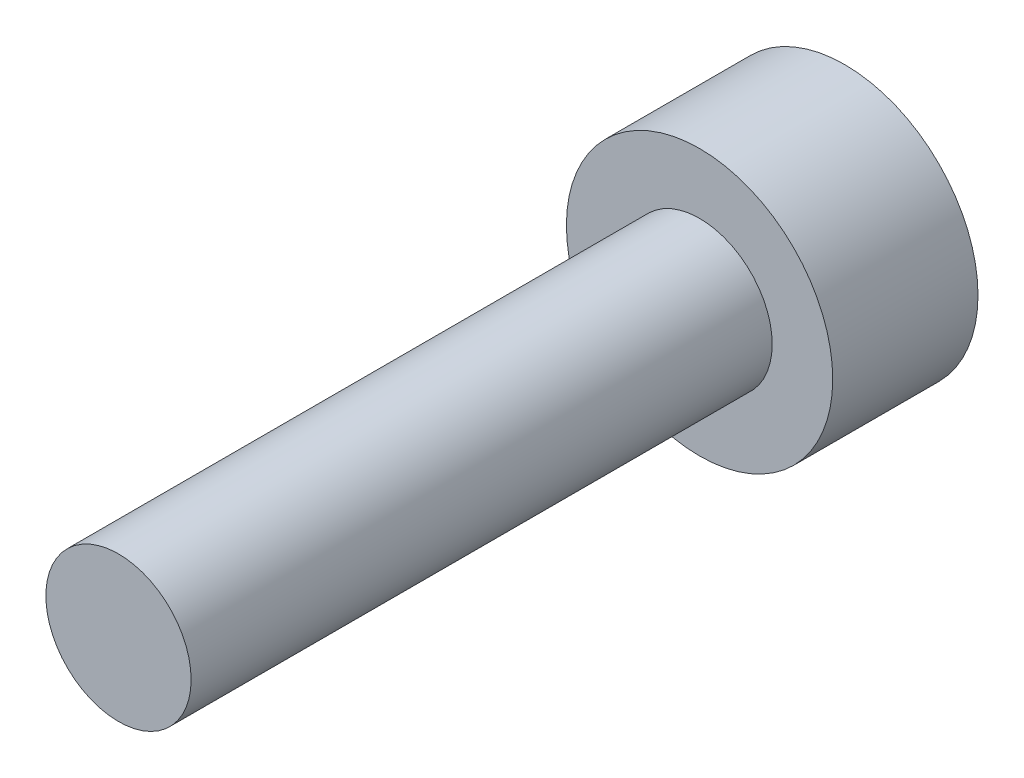
ISO-10303-21;
HEADER;
FILE_DESCRIPTION(('STEP AP214'),'2;1');
FILE_NAME('part.step','',(''),(''),'','','');
FILE_SCHEMA(('AUTOMOTIVE_DESIGN { 1 0 10303 214 1 1 1 1 }'));
ENDSEC;
DATA;
#1=APPLICATION_CONTEXT('core data for automotive mechanical design processes');
#2=APPLICATION_PROTOCOL_DEFINITION('international standard','automotive_design',2000,#1);
#3=PRODUCT_CONTEXT('',#1,'mechanical');
#4=PRODUCT('Part','Part','',(#3));
#5=PRODUCT_RELATED_PRODUCT_CATEGORY('part','',(#4));
#6=PRODUCT_DEFINITION_FORMATION('','',#4);
#7=PRODUCT_DEFINITION_CONTEXT('part definition',#1,'design');
#8=PRODUCT_DEFINITION('design','',#6,#7);
#9=PRODUCT_DEFINITION_SHAPE('','',#8);
#10=(LENGTH_UNIT() NAMED_UNIT(*) SI_UNIT(.MILLI.,.METRE.));
#11=(NAMED_UNIT(*) PLANE_ANGLE_UNIT() SI_UNIT($,.RADIAN.));
#12=(NAMED_UNIT(*) SI_UNIT($,.STERADIAN.) SOLID_ANGLE_UNIT());
#13=UNCERTAINTY_MEASURE_WITH_UNIT(LENGTH_MEASURE(1.E-05),#10,'distance_accuracy_value','');
#14=(GEOMETRIC_REPRESENTATION_CONTEXT(3) GLOBAL_UNCERTAINTY_ASSIGNED_CONTEXT((#13)) GLOBAL_UNIT_ASSIGNED_CONTEXT((#10,
#11,#12)) REPRESENTATION_CONTEXT('',''));
#15=CARTESIAN_POINT('',(0.,0.,0.));
#16=DIRECTION('',(0.,0.,1.));
#17=DIRECTION('',(1.,0.,0.));
#18=AXIS2_PLACEMENT_3D('',#15,#16,#17);
#19=CARTESIAN_POINT('',(0.,0.,-3.));
#20=DIRECTION('',(0.,0.,1.));
#21=DIRECTION('',(1.,0.,0.));
#22=AXIS2_PLACEMENT_3D('',#19,#20,#21);
#23=PLANE('',#22);
#24=CARTESIAN_POINT('',(0.,0.,-3.));
#25=DIRECTION('',(0.,0.,1.));
#26=DIRECTION('',(1.,0.,0.));
#27=AXIS2_PLACEMENT_3D('',#24,#25,#26);
#28=CIRCLE('',#27,2.75);
#29=CARTESIAN_POINT('',(2.75,0.,-3.));
#30=VERTEX_POINT('',#29);
#31=EDGE_CURVE('E50',#30,#30,#28,.T.);
#32=ORIENTED_EDGE('',*,*,#31,.F.);
#33=EDGE_LOOP('',(#32));
#34=FACE_BOUND('',#33,.T.);
#35=DIRECTION('',(0.866025403784441,-0.499999999999995,0.));
#36=VECTOR('',#35,1.);
#37=CARTESIAN_POINT('',(-1.24999999999999,-0.721687836487047,-3.));
#38=LINE('',#37,#36);
#39=CARTESIAN_POINT('',(-1.24999999999999,-0.721687836487047,-3.));
#40=VERTEX_POINT('',#39);
#41=CARTESIAN_POINT('',(0.,-1.44337567297406,-3.));
#42=VERTEX_POINT('',#41);
#43=EDGE_CURVE('E62',#40,#42,#38,.T.);
#44=ORIENTED_EDGE('',*,*,#43,.T.);
#45=DIRECTION('',(0.866025403784438,0.500000000000001,0.));
#46=VECTOR('',#45,1.);
#47=CARTESIAN_POINT('',(0.,-1.44337567297406,-3.));
#48=LINE('',#47,#46);
#49=CARTESIAN_POINT('',(1.25,-0.721687836487029,-3.));
#50=VERTEX_POINT('',#49);
#51=EDGE_CURVE('E139',#42,#50,#48,.T.);
#52=ORIENTED_EDGE('',*,*,#51,.T.);
#53=DIRECTION('',(0.,1.,0.));
#54=VECTOR('',#53,1.);
#55=CARTESIAN_POINT('',(1.25,-0.721687836487029,-3.));
#56=LINE('',#55,#54);
#57=CARTESIAN_POINT('',(1.25,0.721687836487038,-3.));
#58=VERTEX_POINT('',#57);
#59=EDGE_CURVE('E141',#50,#58,#56,.T.);
#60=ORIENTED_EDGE('',*,*,#59,.T.);
#61=DIRECTION('',(-0.866025403784442,0.499999999999995,0.));
#62=VECTOR('',#61,1.);
#63=CARTESIAN_POINT('',(1.25,0.721687836487038,-3.));
#64=LINE('',#63,#62);
#65=CARTESIAN_POINT('',(0.,1.44337567297406,-3.));
#66=VERTEX_POINT('',#65);
#67=EDGE_CURVE('E150',#58,#66,#64,.T.);
#68=ORIENTED_EDGE('',*,*,#67,.T.);
#69=DIRECTION('',(-0.866025403784434,-0.500000000000007,0.));
#70=VECTOR('',#69,1.);
#71=CARTESIAN_POINT('',(0.,1.44337567297406,-3.));
#72=LINE('',#71,#70);
#73=CARTESIAN_POINT('',(-1.25000000000001,0.721687836487021,-3.));
#74=VERTEX_POINT('',#73);
#75=EDGE_CURVE('E123',#66,#74,#72,.T.);
#76=ORIENTED_EDGE('',*,*,#75,.T.);
#77=DIRECTION('',(0.,-1.,0.));
#78=VECTOR('',#77,1.);
#79=CARTESIAN_POINT('',(-1.25000000000001,0.721687836487021,-3.));
#80=LINE('',#79,#78);
#81=EDGE_CURVE('E151',#74,#40,#80,.T.);
#82=ORIENTED_EDGE('',*,*,#81,.T.);
#83=EDGE_LOOP('',(#44,#52,#60,#68,#76,#82));
#84=FACE_BOUND('',#83,.T.);
#85=ADVANCED_FACE('F43',(#34,#84),#23,.F.);
#86=CARTESIAN_POINT('',(0.,0.,0.));
#87=DIRECTION('',(0.,0.,-1.));
#88=DIRECTION('',(-1.,0.,0.));
#89=AXIS2_PLACEMENT_3D('',#86,#87,#88);
#90=CYLINDRICAL_SURFACE('',#89,2.75);
#91=CARTESIAN_POINT('',(0.,0.,0.));
#92=DIRECTION('',(0.,0.,1.));
#93=DIRECTION('',(1.,0.,0.));
#94=AXIS2_PLACEMENT_3D('',#91,#92,#93);
#95=CIRCLE('',#94,2.75);
#96=CARTESIAN_POINT('',(2.75,0.,0.));
#97=VERTEX_POINT('',#96);
#98=EDGE_CURVE('E52',#97,#97,#95,.T.);
#99=ORIENTED_EDGE('',*,*,#98,.F.);
#100=EDGE_LOOP('',(#99));
#101=FACE_BOUND('',#100,.T.);
#102=ORIENTED_EDGE('',*,*,#31,.T.);
#103=EDGE_LOOP('',(#102));
#104=FACE_BOUND('',#103,.T.);
#105=ADVANCED_FACE('F44',(#101,#104),#90,.T.);
#106=CARTESIAN_POINT('',(0.,0.,0.));
#107=DIRECTION('',(0.,0.,1.));
#108=DIRECTION('',(1.,0.,0.));
#109=AXIS2_PLACEMENT_3D('',#106,#107,#108);
#110=PLANE('',#109);
#111=CARTESIAN_POINT('',(0.,0.,0.));
#112=DIRECTION('',(0.,0.,1.));
#113=DIRECTION('',(1.,0.,0.));
#114=AXIS2_PLACEMENT_3D('',#111,#112,#113);
#115=CIRCLE('',#114,1.5);
#116=CARTESIAN_POINT('',(1.5,0.,0.));
#117=VERTEX_POINT('',#116);
#118=EDGE_CURVE('E11',#117,#117,#115,.T.);
#119=ORIENTED_EDGE('',*,*,#118,.F.);
#120=EDGE_LOOP('',(#119));
#121=FACE_BOUND('',#120,.T.);
#122=ORIENTED_EDGE('',*,*,#98,.T.);
#123=EDGE_LOOP('',(#122));
#124=FACE_BOUND('',#123,.T.);
#125=ADVANCED_FACE('F211',(#121,#124),#110,.T.);
#126=CARTESIAN_POINT('',(0.,0.,12.));
#127=DIRECTION('',(0.,0.,-1.));
#128=DIRECTION('',(-1.,0.,0.));
#129=AXIS2_PLACEMENT_3D('',#126,#127,#128);
#130=CYLINDRICAL_SURFACE('',#129,1.5);
#131=CARTESIAN_POINT('',(0.,0.,12.));
#132=DIRECTION('',(0.,0.,1.));
#133=DIRECTION('',(1.,0.,0.));
#134=AXIS2_PLACEMENT_3D('',#131,#132,#133);
#135=CIRCLE('',#134,1.5);
#136=CARTESIAN_POINT('',(1.5,0.,12.));
#137=VERTEX_POINT('',#136);
#138=EDGE_CURVE('E169',#137,#137,#135,.T.);
#139=ORIENTED_EDGE('',*,*,#138,.F.);
#140=EDGE_LOOP('',(#139));
#141=FACE_BOUND('',#140,.T.);
#142=ORIENTED_EDGE('',*,*,#118,.T.);
#143=EDGE_LOOP('',(#142));
#144=FACE_BOUND('',#143,.T.);
#145=ADVANCED_FACE('F210',(#141,#144),#130,.T.);
#146=CARTESIAN_POINT('',(0.,0.,12.));
#147=DIRECTION('',(0.,0.,1.));
#148=DIRECTION('',(1.,0.,0.));
#149=AXIS2_PLACEMENT_3D('',#146,#147,#148);
#150=PLANE('',#149);
#151=ORIENTED_EDGE('',*,*,#138,.T.);
#152=EDGE_LOOP('',(#151));
#153=FACE_BOUND('',#152,.T.);
#154=ADVANCED_FACE('F203',(#153),#150,.T.);
#155=CARTESIAN_POINT('',(-1.24999999999999,-0.721687836487047,-1.5));
#156=DIRECTION('',(0.499999999999995,0.866025403784441,0.));
#157=DIRECTION('',(-0.866025403784442,0.499999999999995,0.));
#158=AXIS2_PLACEMENT_3D('',#155,#156,#157);
#159=PLANE('',#158);
#160=ORIENTED_EDGE('',*,*,#43,.F.);
#161=DIRECTION('',(0.,0.,-1.));
#162=VECTOR('',#161,1.);
#163=CARTESIAN_POINT('',(-1.24999999999999,-0.721687836487047,-1.5));
#164=LINE('',#163,#162);
#165=CARTESIAN_POINT('',(-1.24999999999999,-0.721687836487047,-1.5));
#166=VERTEX_POINT('',#165);
#167=EDGE_CURVE('E134',#166,#40,#164,.T.);
#168=ORIENTED_EDGE('',*,*,#167,.F.);
#169=DIRECTION('',(0.866025403784441,-0.499999999999995,0.));
#170=VECTOR('',#169,1.);
#171=CARTESIAN_POINT('',(-1.24999999999999,-0.721687836487047,-1.5));
#172=LINE('',#171,#170);
#173=CARTESIAN_POINT('',(0.,-1.44337567297406,-1.5));
#174=VERTEX_POINT('',#173);
#175=EDGE_CURVE('E154',#166,#174,#172,.T.);
#176=ORIENTED_EDGE('',*,*,#175,.T.);
#177=DIRECTION('',(0.,0.,-1.));
#178=VECTOR('',#177,1.);
#179=CARTESIAN_POINT('',(0.,-1.44337567297406,-1.5));
#180=LINE('',#179,#178);
#181=EDGE_CURVE('E164',#174,#42,#180,.T.);
#182=ORIENTED_EDGE('',*,*,#181,.T.);
#183=EDGE_LOOP('',(#160,#168,#176,#182));
#184=FACE_BOUND('',#183,.T.);
#185=ADVANCED_FACE('F181',(#184),#159,.T.);
#186=CARTESIAN_POINT('',(0.,-1.44337567297406,-1.5));
#187=DIRECTION('',(-0.500000000000001,0.866025403784438,0.));
#188=DIRECTION('',(-0.866025403784438,-0.500000000000001,0.));
#189=AXIS2_PLACEMENT_3D('',#186,#187,#188);
#190=PLANE('',#189);
#191=ORIENTED_EDGE('',*,*,#51,.F.);
#192=ORIENTED_EDGE('',*,*,#181,.F.);
#193=DIRECTION('',(0.866025403784438,0.500000000000001,0.));
#194=VECTOR('',#193,1.);
#195=CARTESIAN_POINT('',(0.,-1.44337567297406,-1.5));
#196=LINE('',#195,#194);
#197=CARTESIAN_POINT('',(1.25,-0.721687836487029,-1.5));
#198=VERTEX_POINT('',#197);
#199=EDGE_CURVE('E99',#174,#198,#196,.T.);
#200=ORIENTED_EDGE('',*,*,#199,.T.);
#201=DIRECTION('',(0.,0.,-1.));
#202=VECTOR('',#201,1.);
#203=CARTESIAN_POINT('',(1.25,-0.721687836487029,-1.5));
#204=LINE('',#203,#202);
#205=EDGE_CURVE('E165',#198,#50,#204,.T.);
#206=ORIENTED_EDGE('',*,*,#205,.T.);
#207=EDGE_LOOP('',(#191,#192,#200,#206));
#208=FACE_BOUND('',#207,.T.);
#209=ADVANCED_FACE('F194',(#208),#190,.T.);
#210=CARTESIAN_POINT('',(1.25,-0.721687836487029,-1.5));
#211=DIRECTION('',(-1.,0.,0.));
#212=DIRECTION('',(0.,-1.,0.));
#213=AXIS2_PLACEMENT_3D('',#210,#211,#212);
#214=PLANE('',#213);
#215=ORIENTED_EDGE('',*,*,#59,.F.);
#216=ORIENTED_EDGE('',*,*,#205,.F.);
#217=DIRECTION('',(0.,1.,0.));
#218=VECTOR('',#217,1.);
#219=CARTESIAN_POINT('',(1.25,-0.721687836487029,-1.5));
#220=LINE('',#219,#218);
#221=CARTESIAN_POINT('',(1.25,0.721687836487038,-1.5));
#222=VERTEX_POINT('',#221);
#223=EDGE_CURVE('E116',#198,#222,#220,.T.);
#224=ORIENTED_EDGE('',*,*,#223,.T.);
#225=DIRECTION('',(0.,0.,-1.));
#226=VECTOR('',#225,1.);
#227=CARTESIAN_POINT('',(1.25,0.721687836487038,-1.5));
#228=LINE('',#227,#226);
#229=EDGE_CURVE('E113',#222,#58,#228,.T.);
#230=ORIENTED_EDGE('',*,*,#229,.T.);
#231=EDGE_LOOP('',(#215,#216,#224,#230));
#232=FACE_BOUND('',#231,.T.);
#233=ADVANCED_FACE('F195',(#232),#214,.T.);
#234=CARTESIAN_POINT('',(1.25,0.721687836487038,-1.5));
#235=DIRECTION('',(-0.499999999999995,-0.866025403784441,0.));
#236=DIRECTION('',(0.866025403784442,-0.499999999999995,0.));
#237=AXIS2_PLACEMENT_3D('',#234,#235,#236);
#238=PLANE('',#237);
#239=ORIENTED_EDGE('',*,*,#67,.F.);
#240=ORIENTED_EDGE('',*,*,#229,.F.);
#241=DIRECTION('',(-0.866025403784442,0.499999999999995,0.));
#242=VECTOR('',#241,1.);
#243=CARTESIAN_POINT('',(1.25,0.721687836487038,-1.5));
#244=LINE('',#243,#242);
#245=CARTESIAN_POINT('',(0.,1.44337567297406,-1.5));
#246=VERTEX_POINT('',#245);
#247=EDGE_CURVE('E109',#222,#246,#244,.T.);
#248=ORIENTED_EDGE('',*,*,#247,.T.);
#249=DIRECTION('',(0.,0.,-1.));
#250=VECTOR('',#249,1.);
#251=CARTESIAN_POINT('',(0.,1.44337567297406,-1.5));
#252=LINE('',#251,#250);
#253=EDGE_CURVE('E111',#246,#66,#252,.T.);
#254=ORIENTED_EDGE('',*,*,#253,.T.);
#255=EDGE_LOOP('',(#239,#240,#248,#254));
#256=FACE_BOUND('',#255,.T.);
#257=ADVANCED_FACE('F114',(#256),#238,.T.);
#258=CARTESIAN_POINT('',(0.,1.44337567297406,-1.5));
#259=DIRECTION('',(0.500000000000007,-0.866025403784435,0.));
#260=DIRECTION('',(0.866025403784434,0.500000000000007,0.));
#261=AXIS2_PLACEMENT_3D('',#258,#259,#260);
#262=PLANE('',#261);
#263=ORIENTED_EDGE('',*,*,#75,.F.);
#264=ORIENTED_EDGE('',*,*,#253,.F.);
#265=DIRECTION('',(-0.866025403784434,-0.500000000000007,0.));
#266=VECTOR('',#265,1.);
#267=CARTESIAN_POINT('',(0.,1.44337567297406,-1.5));
#268=LINE('',#267,#266);
#269=CARTESIAN_POINT('',(-1.25000000000001,0.721687836487021,-1.5));
#270=VERTEX_POINT('',#269);
#271=EDGE_CURVE('E119',#246,#270,#268,.T.);
#272=ORIENTED_EDGE('',*,*,#271,.T.);
#273=DIRECTION('',(0.,0.,-1.));
#274=VECTOR('',#273,1.);
#275=CARTESIAN_POINT('',(-1.25000000000001,0.721687836487021,-1.5));
#276=LINE('',#275,#274);
#277=EDGE_CURVE('E93',#270,#74,#276,.T.);
#278=ORIENTED_EDGE('',*,*,#277,.T.);
#279=EDGE_LOOP('',(#263,#264,#272,#278));
#280=FACE_BOUND('',#279,.T.);
#281=ADVANCED_FACE('F122',(#280),#262,.T.);
#282=CARTESIAN_POINT('',(-1.25000000000001,0.721687836487021,-1.5));
#283=DIRECTION('',(1.,0.,0.));
#284=DIRECTION('',(0.,1.,0.));
#285=AXIS2_PLACEMENT_3D('',#282,#283,#284);
#286=PLANE('',#285);
#287=ORIENTED_EDGE('',*,*,#81,.F.);
#288=ORIENTED_EDGE('',*,*,#277,.F.);
#289=DIRECTION('',(0.,-1.,0.));
#290=VECTOR('',#289,1.);
#291=CARTESIAN_POINT('',(-1.25000000000001,0.721687836487021,-1.5));
#292=LINE('',#291,#290);
#293=EDGE_CURVE('E69',#270,#166,#292,.T.);
#294=ORIENTED_EDGE('',*,*,#293,.T.);
#295=ORIENTED_EDGE('',*,*,#167,.T.);
#296=EDGE_LOOP('',(#287,#288,#294,#295));
#297=FACE_BOUND('',#296,.T.);
#298=ADVANCED_FACE('F185',(#297),#286,.T.);
#299=CARTESIAN_POINT('',(0.,0.,-1.5));
#300=DIRECTION('',(0.,0.,1.));
#301=DIRECTION('',(1.,0.,0.));
#302=AXIS2_PLACEMENT_3D('',#299,#300,#301);
#303=PLANE('',#302);
#304=ORIENTED_EDGE('',*,*,#175,.F.);
#305=ORIENTED_EDGE('',*,*,#293,.F.);
#306=ORIENTED_EDGE('',*,*,#271,.F.);
#307=ORIENTED_EDGE('',*,*,#247,.F.);
#308=ORIENTED_EDGE('',*,*,#223,.F.);
#309=ORIENTED_EDGE('',*,*,#199,.F.);
#310=EDGE_LOOP('',(#304,#305,#306,#307,#308,#309));
#311=FACE_BOUND('',#310,.T.);
#312=ADVANCED_FACE('F130',(#311),#303,.F.);
#313=CLOSED_SHELL('',(#85,#105,#125,#145,#154,#185,#209,#233,#257,#281,#298,#312));
#314=MANIFOLD_SOLID_BREP('B2',#313);
#315=ADVANCED_BREP_SHAPE_REPRESENTATION('',(#18,#314),#14);
#316=SHAPE_DEFINITION_REPRESENTATION(#9,#315);
ENDSEC;
END-ISO-10303-21;
